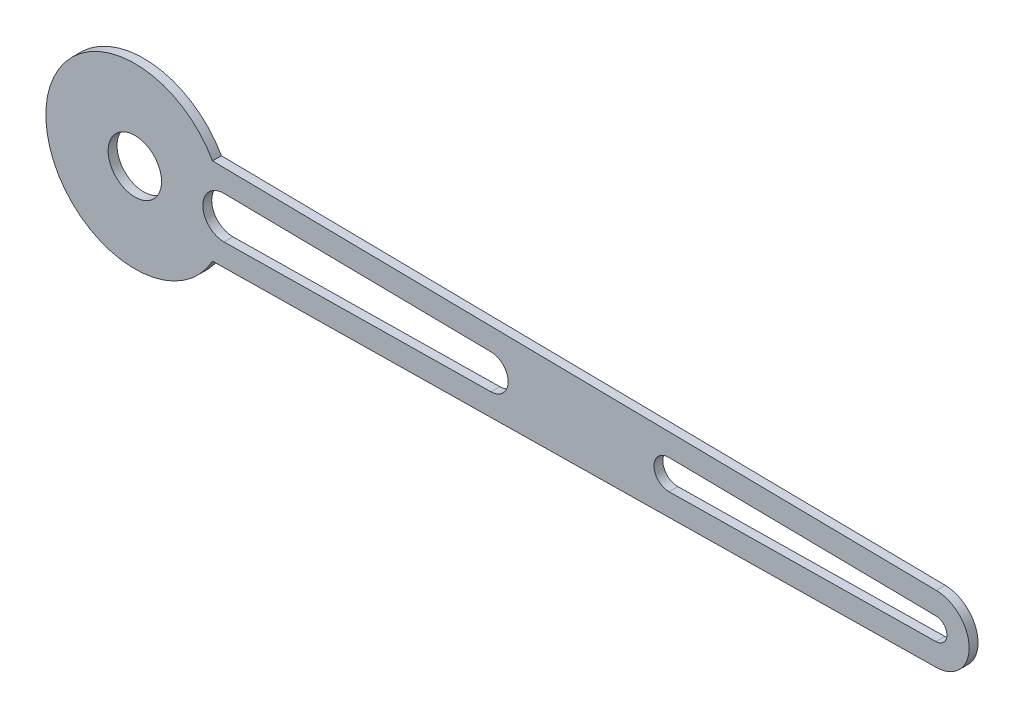
ISO-10303-21;
HEADER;
FILE_DESCRIPTION(('STEP AP214'),'2;1');
FILE_NAME('part.step','',(''),(''),'','','');
FILE_SCHEMA(('AUTOMOTIVE_DESIGN { 1 0 10303 214 1 1 1 1 }'));
ENDSEC;
DATA;
#1=APPLICATION_CONTEXT('core data for automotive mechanical design processes');
#2=APPLICATION_PROTOCOL_DEFINITION('international standard','automotive_design',2000,#1);
#3=PRODUCT_CONTEXT('',#1,'mechanical');
#4=PRODUCT('Part','Part','',(#3));
#5=PRODUCT_RELATED_PRODUCT_CATEGORY('part','',(#4));
#6=PRODUCT_DEFINITION_FORMATION('','',#4);
#7=PRODUCT_DEFINITION_CONTEXT('part definition',#1,'design');
#8=PRODUCT_DEFINITION('design','',#6,#7);
#9=PRODUCT_DEFINITION_SHAPE('','',#8);
#10=(LENGTH_UNIT() NAMED_UNIT(*) SI_UNIT(.MILLI.,.METRE.));
#11=(NAMED_UNIT(*) PLANE_ANGLE_UNIT() SI_UNIT($,.RADIAN.));
#12=(NAMED_UNIT(*) SI_UNIT($,.STERADIAN.) SOLID_ANGLE_UNIT());
#13=UNCERTAINTY_MEASURE_WITH_UNIT(LENGTH_MEASURE(1.E-05),#10,'distance_accuracy_value','');
#14=(GEOMETRIC_REPRESENTATION_CONTEXT(3) GLOBAL_UNCERTAINTY_ASSIGNED_CONTEXT((#13)) GLOBAL_UNIT_ASSIGNED_CONTEXT((#10,
#11,#12)) REPRESENTATION_CONTEXT('',''));
#15=CARTESIAN_POINT('',(0.,0.,0.));
#16=DIRECTION('',(0.,0.,1.));
#17=DIRECTION('',(1.,0.,0.));
#18=AXIS2_PLACEMENT_3D('',#15,#16,#17);
#19=CARTESIAN_POINT('',(9.,0.,0.1));
#20=DIRECTION('',(0.,0.,1.));
#21=DIRECTION('',(1.,0.,0.));
#22=AXIS2_PLACEMENT_3D('',#19,#20,#21);
#23=PLANE('',#22);
#24=DIRECTION('',(-0.999903544730907,0.0138888888888889,0.));
#25=VECTOR('',#24,1.);
#26=CARTESIAN_POINT('',(6.00231481481481,0.166650590788484,0.1));
#27=LINE('',#26,#25);
#28=CARTESIAN_POINT('',(9.00173611111111,0.124987943091363,0.1));
#29=VERTEX_POINT('',#28);
#30=CARTESIAN_POINT('',(6.00231481481481,0.166650590788484,0.1));
#31=VERTEX_POINT('',#30);
#32=EDGE_CURVE('E138',#29,#31,#27,.T.);
#33=ORIENTED_EDGE('',*,*,#32,.F.);
#34=CARTESIAN_POINT('',(9.,0.,0.1));
#35=DIRECTION('',(0.,0.,1.));
#36=DIRECTION('',(1.,0.,0.));
#37=AXIS2_PLACEMENT_3D('',#34,#35,#36);
#38=CIRCLE('',#37,0.125);
#39=CARTESIAN_POINT('',(9.00173611111111,-0.124987943091363,0.1));
#40=VERTEX_POINT('',#39);
#41=EDGE_CURVE('E130',#40,#29,#38,.T.);
#42=ORIENTED_EDGE('',*,*,#41,.F.);
#43=DIRECTION('',(0.999903544730907,0.0138888888888889,0.));
#44=VECTOR('',#43,1.);
#45=CARTESIAN_POINT('',(6.00231481481481,-0.166650590788484,0.1));
#46=LINE('',#45,#44);
#47=CARTESIAN_POINT('',(6.00231481481481,-0.166650590788484,0.1));
#48=VERTEX_POINT('',#47);
#49=EDGE_CURVE('E153',#48,#40,#46,.T.);
#50=ORIENTED_EDGE('',*,*,#49,.F.);
#51=CARTESIAN_POINT('',(6.,0.,0.1));
#52=DIRECTION('',(0.,0.,1.));
#53=DIRECTION('',(1.,0.,0.));
#54=AXIS2_PLACEMENT_3D('',#51,#52,#53);
#55=CIRCLE('',#54,0.166666666666667);
#56=EDGE_CURVE('E151',#31,#48,#55,.T.);
#57=ORIENTED_EDGE('',*,*,#56,.F.);
#58=EDGE_LOOP('',(#33,#42,#50,#57));
#59=FACE_BOUND('',#58,.T.);
#60=CARTESIAN_POINT('',(9.,0.,0.1));
#61=DIRECTION('',(0.,0.,1.));
#62=DIRECTION('',(1.,0.,0.));
#63=AXIS2_PLACEMENT_3D('',#60,#61,#62);
#64=CIRCLE('',#63,0.375);
#65=CARTESIAN_POINT('',(9.00520833333333,-0.37496382927409,0.1));
#66=VERTEX_POINT('',#65);
#67=CARTESIAN_POINT('',(9.00520833333333,0.37496382927409,0.1));
#68=VERTEX_POINT('',#67);
#69=EDGE_CURVE('E200',#66,#68,#64,.T.);
#70=ORIENTED_EDGE('',*,*,#69,.T.);
#71=DIRECTION('',(-0.999903544730907,0.0138888888888889,0.));
#72=VECTOR('',#71,1.);
#73=CARTESIAN_POINT('',(0.872886315515519,0.487923641757336,0.1));
#74=LINE('',#73,#72);
#75=CARTESIAN_POINT('',(0.872886315515519,0.487923641757336,0.1));
#76=VERTEX_POINT('',#75);
#77=EDGE_CURVE('E203',#68,#76,#74,.T.);
#78=ORIENTED_EDGE('',*,*,#77,.T.);
#79=CARTESIAN_POINT('',(0.,0.,0.1));
#80=DIRECTION('',(0.,0.,1.));
#81=DIRECTION('',(1.,0.,0.));
#82=AXIS2_PLACEMENT_3D('',#79,#80,#81);
#83=CIRCLE('',#82,1.);
#84=CARTESIAN_POINT('',(0.872886315515519,-0.487923641757336,0.1));
#85=VERTEX_POINT('',#84);
#86=EDGE_CURVE('E206',#76,#85,#83,.T.);
#87=ORIENTED_EDGE('',*,*,#86,.T.);
#88=DIRECTION('',(0.999903544730907,0.0138888888888889,0.));
#89=VECTOR('',#88,1.);
#90=CARTESIAN_POINT('',(0.872886315515519,-0.487923641757336,0.1));
#91=LINE('',#90,#89);
#92=EDGE_CURVE('E208',#85,#66,#91,.T.);
#93=ORIENTED_EDGE('',*,*,#92,.T.);
#94=EDGE_LOOP('',(#70,#78,#87,#93));
#95=FACE_BOUND('',#94,.T.);
#96=DIRECTION('',(0.999903544730907,0.0138888888888889,0.));
#97=VECTOR('',#96,1.);
#98=CARTESIAN_POINT('',(1.00327932098765,-0.236088336950353,0.1));
#99=LINE('',#98,#97);
#100=CARTESIAN_POINT('',(1.00327932098765,-0.236088336950353,0.1));
#101=VERTEX_POINT('',#100);
#102=CARTESIAN_POINT('',(4.00270061728395,-0.194425689253232,0.1));
#103=VERTEX_POINT('',#102);
#104=EDGE_CURVE('E171',#101,#103,#99,.T.);
#105=ORIENTED_EDGE('',*,*,#104,.F.);
#106=CARTESIAN_POINT('',(1.,0.,0.1));
#107=DIRECTION('',(0.,0.,1.));
#108=DIRECTION('',(1.,0.,0.));
#109=AXIS2_PLACEMENT_3D('',#106,#107,#108);
#110=CIRCLE('',#109,0.236111111111111);
#111=CARTESIAN_POINT('',(1.00327932098765,0.236088336950353,0.1));
#112=VERTEX_POINT('',#111);
#113=EDGE_CURVE('E169',#112,#101,#110,.T.);
#114=ORIENTED_EDGE('',*,*,#113,.F.);
#115=DIRECTION('',(-0.999903544730907,0.0138888888888889,0.));
#116=VECTOR('',#115,1.);
#117=CARTESIAN_POINT('',(1.00327932098765,0.236088336950353,0.1));
#118=LINE('',#117,#116);
#119=CARTESIAN_POINT('',(4.00270061728395,0.194425689253232,0.1));
#120=VERTEX_POINT('',#119);
#121=EDGE_CURVE('E177',#120,#112,#118,.T.);
#122=ORIENTED_EDGE('',*,*,#121,.F.);
#123=CARTESIAN_POINT('',(4.,0.,0.1));
#124=DIRECTION('',(0.,0.,1.));
#125=DIRECTION('',(1.,0.,0.));
#126=AXIS2_PLACEMENT_3D('',#123,#124,#125);
#127=CIRCLE('',#126,0.194444444444444);
#128=EDGE_CURVE('E174',#103,#120,#127,.T.);
#129=ORIENTED_EDGE('',*,*,#128,.F.);
#130=EDGE_LOOP('',(#105,#114,#122,#129));
#131=FACE_BOUND('',#130,.T.);
#132=CARTESIAN_POINT('',(0.,0.,0.1));
#133=DIRECTION('',(0.,0.,1.));
#134=DIRECTION('',(1.,0.,0.));
#135=AXIS2_PLACEMENT_3D('',#132,#133,#134);
#136=CIRCLE('',#135,0.3);
#137=CARTESIAN_POINT('',(0.3,0.,0.1));
#138=VERTEX_POINT('',#137);
#139=EDGE_CURVE('E159',#138,#138,#136,.T.);
#140=ORIENTED_EDGE('',*,*,#139,.F.);
#141=EDGE_LOOP('',(#140));
#142=FACE_BOUND('',#141,.T.);
#143=ADVANCED_FACE('F41',(#59,#95,#131,#142),#23,.T.);
#144=CARTESIAN_POINT('',(9.,0.,0.));
#145=DIRECTION('',(0.,0.,1.));
#146=DIRECTION('',(1.,0.,0.));
#147=AXIS2_PLACEMENT_3D('',#144,#145,#146);
#148=PLANE('',#147);
#149=CARTESIAN_POINT('',(9.,0.,0.));
#150=DIRECTION('',(0.,0.,1.));
#151=DIRECTION('',(1.,0.,0.));
#152=AXIS2_PLACEMENT_3D('',#149,#150,#151);
#153=CIRCLE('',#152,0.125);
#154=CARTESIAN_POINT('',(9.00173611111111,-0.124987943091363,0.));
#155=VERTEX_POINT('',#154);
#156=CARTESIAN_POINT('',(9.00173611111111,0.124987943091363,0.));
#157=VERTEX_POINT('',#156);
#158=EDGE_CURVE('E64',#155,#157,#153,.T.);
#159=ORIENTED_EDGE('',*,*,#158,.T.);
#160=DIRECTION('',(-0.999903544730907,0.0138888888888889,0.));
#161=VECTOR('',#160,1.);
#162=CARTESIAN_POINT('',(6.00231481481481,0.166650590788484,0.));
#163=LINE('',#162,#161);
#164=CARTESIAN_POINT('',(6.00231481481481,0.166650590788484,0.));
#165=VERTEX_POINT('',#164);
#166=EDGE_CURVE('E145',#157,#165,#163,.T.);
#167=ORIENTED_EDGE('',*,*,#166,.T.);
#168=CARTESIAN_POINT('',(6.,0.,0.));
#169=DIRECTION('',(0.,0.,1.));
#170=DIRECTION('',(1.,0.,0.));
#171=AXIS2_PLACEMENT_3D('',#168,#169,#170);
#172=CIRCLE('',#171,0.166666666666667);
#173=CARTESIAN_POINT('',(6.00231481481481,-0.166650590788484,0.));
#174=VERTEX_POINT('',#173);
#175=EDGE_CURVE('E161',#165,#174,#172,.T.);
#176=ORIENTED_EDGE('',*,*,#175,.T.);
#177=DIRECTION('',(0.999903544730907,0.0138888888888889,0.));
#178=VECTOR('',#177,1.);
#179=CARTESIAN_POINT('',(6.00231481481481,-0.166650590788484,0.));
#180=LINE('',#179,#178);
#181=EDGE_CURVE('E139',#174,#155,#180,.T.);
#182=ORIENTED_EDGE('',*,*,#181,.T.);
#183=EDGE_LOOP('',(#159,#167,#176,#182));
#184=FACE_BOUND('',#183,.T.);
#185=CARTESIAN_POINT('',(9.,0.,0.));
#186=DIRECTION('',(0.,0.,1.));
#187=DIRECTION('',(1.,0.,0.));
#188=AXIS2_PLACEMENT_3D('',#185,#186,#187);
#189=CIRCLE('',#188,0.375);
#190=CARTESIAN_POINT('',(9.00520833333333,-0.37496382927409,0.));
#191=VERTEX_POINT('',#190);
#192=CARTESIAN_POINT('',(9.00520833333333,0.37496382927409,0.));
#193=VERTEX_POINT('',#192);
#194=EDGE_CURVE('E199',#191,#193,#189,.T.);
#195=ORIENTED_EDGE('',*,*,#194,.F.);
#196=DIRECTION('',(0.999903544730907,0.0138888888888889,0.));
#197=VECTOR('',#196,1.);
#198=CARTESIAN_POINT('',(0.872886315515519,-0.487923641757336,0.));
#199=LINE('',#198,#197);
#200=CARTESIAN_POINT('',(0.872886315515519,-0.487923641757336,0.));
#201=VERTEX_POINT('',#200);
#202=EDGE_CURVE('E204',#201,#191,#199,.T.);
#203=ORIENTED_EDGE('',*,*,#202,.F.);
#204=CARTESIAN_POINT('',(0.,0.,0.));
#205=DIRECTION('',(0.,0.,1.));
#206=DIRECTION('',(1.,0.,0.));
#207=AXIS2_PLACEMENT_3D('',#204,#205,#206);
#208=CIRCLE('',#207,1.);
#209=CARTESIAN_POINT('',(0.872886315515519,0.487923641757336,0.));
#210=VERTEX_POINT('',#209);
#211=EDGE_CURVE('E215',#210,#201,#208,.T.);
#212=ORIENTED_EDGE('',*,*,#211,.F.);
#213=DIRECTION('',(-0.999903544730907,0.0138888888888889,0.));
#214=VECTOR('',#213,1.);
#215=CARTESIAN_POINT('',(0.872886315515519,0.487923641757336,0.));
#216=LINE('',#215,#214);
#217=EDGE_CURVE('E213',#193,#210,#216,.T.);
#218=ORIENTED_EDGE('',*,*,#217,.F.);
#219=EDGE_LOOP('',(#195,#203,#212,#218));
#220=FACE_BOUND('',#219,.T.);
#221=CARTESIAN_POINT('',(1.,0.,0.));
#222=DIRECTION('',(0.,0.,1.));
#223=DIRECTION('',(1.,0.,0.));
#224=AXIS2_PLACEMENT_3D('',#221,#222,#223);
#225=CIRCLE('',#224,0.236111111111111);
#226=CARTESIAN_POINT('',(1.00327932098765,0.236088336950353,0.));
#227=VERTEX_POINT('',#226);
#228=CARTESIAN_POINT('',(1.00327932098765,-0.236088336950353,0.));
#229=VERTEX_POINT('',#228);
#230=EDGE_CURVE('E146',#227,#229,#225,.T.);
#231=ORIENTED_EDGE('',*,*,#230,.T.);
#232=DIRECTION('',(0.999903544730907,0.0138888888888889,0.));
#233=VECTOR('',#232,1.);
#234=CARTESIAN_POINT('',(1.00327932098765,-0.236088336950353,0.));
#235=LINE('',#234,#233);
#236=CARTESIAN_POINT('',(4.00270061728395,-0.194425689253232,0.));
#237=VERTEX_POINT('',#236);
#238=EDGE_CURVE('E182',#229,#237,#235,.T.);
#239=ORIENTED_EDGE('',*,*,#238,.T.);
#240=CARTESIAN_POINT('',(4.,0.,0.));
#241=DIRECTION('',(0.,0.,1.));
#242=DIRECTION('',(1.,0.,0.));
#243=AXIS2_PLACEMENT_3D('',#240,#241,#242);
#244=CIRCLE('',#243,0.194444444444444);
#245=CARTESIAN_POINT('',(4.00270061728395,0.194425689253232,0.));
#246=VERTEX_POINT('',#245);
#247=EDGE_CURVE('E185',#237,#246,#244,.T.);
#248=ORIENTED_EDGE('',*,*,#247,.T.);
#249=DIRECTION('',(-0.999903544730907,0.0138888888888889,0.));
#250=VECTOR('',#249,1.);
#251=CARTESIAN_POINT('',(1.00327932098765,0.236088336950353,0.));
#252=LINE('',#251,#250);
#253=EDGE_CURVE('E172',#246,#227,#252,.T.);
#254=ORIENTED_EDGE('',*,*,#253,.T.);
#255=EDGE_LOOP('',(#231,#239,#248,#254));
#256=FACE_BOUND('',#255,.T.);
#257=CARTESIAN_POINT('',(0.,0.,0.));
#258=DIRECTION('',(0.,0.,1.));
#259=DIRECTION('',(1.,0.,0.));
#260=AXIS2_PLACEMENT_3D('',#257,#258,#259);
#261=CIRCLE('',#260,0.3);
#262=CARTESIAN_POINT('',(0.3,0.,0.));
#263=VERTEX_POINT('',#262);
#264=EDGE_CURVE('E289',#263,#263,#261,.T.);
#265=ORIENTED_EDGE('',*,*,#264,.T.);
#266=EDGE_LOOP('',(#265));
#267=FACE_BOUND('',#266,.T.);
#268=ADVANCED_FACE('F233',(#184,#220,#256,#267),#148,.F.);
#269=CARTESIAN_POINT('',(9.,0.,0.1));
#270=DIRECTION('',(0.,0.,-1.));
#271=DIRECTION('',(-1.,0.,0.));
#272=AXIS2_PLACEMENT_3D('',#269,#270,#271);
#273=CYLINDRICAL_SURFACE('',#272,0.375);
#274=ORIENTED_EDGE('',*,*,#194,.T.);
#275=DIRECTION('',(0.,0.,-1.));
#276=VECTOR('',#275,1.);
#277=CARTESIAN_POINT('',(9.00520833333333,0.37496382927409,0.1));
#278=LINE('',#277,#276);
#279=EDGE_CURVE('E11',#68,#193,#278,.T.);
#280=ORIENTED_EDGE('',*,*,#279,.F.);
#281=ORIENTED_EDGE('',*,*,#69,.F.);
#282=DIRECTION('',(0.,0.,-1.));
#283=VECTOR('',#282,1.);
#284=CARTESIAN_POINT('',(9.00520833333333,-0.37496382927409,0.1));
#285=LINE('',#284,#283);
#286=EDGE_CURVE('E210',#66,#191,#285,.T.);
#287=ORIENTED_EDGE('',*,*,#286,.T.);
#288=EDGE_LOOP('',(#274,#280,#281,#287));
#289=FACE_BOUND('',#288,.T.);
#290=ADVANCED_FACE('F43',(#289),#273,.T.);
#291=CARTESIAN_POINT('',(0.872886315515519,0.487923641757336,0.1));
#292=DIRECTION('',(-0.0138888888888889,-0.999903544730907,0.));
#293=DIRECTION('',(0.999903544730907,-0.0138888888888889,0.));
#294=AXIS2_PLACEMENT_3D('',#291,#292,#293);
#295=PLANE('',#294);
#296=ORIENTED_EDGE('',*,*,#217,.T.);
#297=DIRECTION('',(0.,0.,-1.));
#298=VECTOR('',#297,1.);
#299=CARTESIAN_POINT('',(0.872886315515519,0.487923641757336,0.1));
#300=LINE('',#299,#298);
#301=EDGE_CURVE('E49',#76,#210,#300,.T.);
#302=ORIENTED_EDGE('',*,*,#301,.F.);
#303=ORIENTED_EDGE('',*,*,#77,.F.);
#304=ORIENTED_EDGE('',*,*,#279,.T.);
#305=EDGE_LOOP('',(#296,#302,#303,#304));
#306=FACE_BOUND('',#305,.T.);
#307=ADVANCED_FACE('F243',(#306),#295,.F.);
#308=CARTESIAN_POINT('',(0.,0.,0.1));
#309=DIRECTION('',(0.,0.,-1.));
#310=DIRECTION('',(-1.,0.,0.));
#311=AXIS2_PLACEMENT_3D('',#308,#309,#310);
#312=CYLINDRICAL_SURFACE('',#311,1.);
#313=ORIENTED_EDGE('',*,*,#211,.T.);
#314=DIRECTION('',(0.,0.,-1.));
#315=VECTOR('',#314,1.);
#316=CARTESIAN_POINT('',(0.872886315515519,-0.487923641757336,0.1));
#317=LINE('',#316,#315);
#318=EDGE_CURVE('E220',#85,#201,#317,.T.);
#319=ORIENTED_EDGE('',*,*,#318,.F.);
#320=ORIENTED_EDGE('',*,*,#86,.F.);
#321=ORIENTED_EDGE('',*,*,#301,.T.);
#322=EDGE_LOOP('',(#313,#319,#320,#321));
#323=FACE_BOUND('',#322,.T.);
#324=ADVANCED_FACE('F227',(#323),#312,.T.);
#325=CARTESIAN_POINT('',(0.872886315515519,-0.487923641757336,0.1));
#326=DIRECTION('',(-0.0138888888888889,0.999903544730907,0.));
#327=DIRECTION('',(-0.999903544730907,-0.0138888888888889,0.));
#328=AXIS2_PLACEMENT_3D('',#325,#326,#327);
#329=PLANE('',#328);
#330=ORIENTED_EDGE('',*,*,#202,.T.);
#331=ORIENTED_EDGE('',*,*,#286,.F.);
#332=ORIENTED_EDGE('',*,*,#92,.F.);
#333=ORIENTED_EDGE('',*,*,#318,.T.);
#334=EDGE_LOOP('',(#330,#331,#332,#333));
#335=FACE_BOUND('',#334,.T.);
#336=ADVANCED_FACE('F237',(#335),#329,.F.);
#337=CARTESIAN_POINT('',(1.,0.,0.1));
#338=DIRECTION('',(0.,0.,-1.));
#339=DIRECTION('',(-1.,0.,0.));
#340=AXIS2_PLACEMENT_3D('',#337,#338,#339);
#341=CYLINDRICAL_SURFACE('',#340,0.236111111111111);
#342=ORIENTED_EDGE('',*,*,#230,.F.);
#343=DIRECTION('',(0.,0.,-1.));
#344=VECTOR('',#343,1.);
#345=CARTESIAN_POINT('',(1.00327932098765,0.236088336950353,0.1));
#346=LINE('',#345,#344);
#347=EDGE_CURVE('E179',#112,#227,#346,.T.);
#348=ORIENTED_EDGE('',*,*,#347,.F.);
#349=ORIENTED_EDGE('',*,*,#113,.T.);
#350=DIRECTION('',(0.,0.,-1.));
#351=VECTOR('',#350,1.);
#352=CARTESIAN_POINT('',(1.00327932098765,-0.236088336950353,0.1));
#353=LINE('',#352,#351);
#354=EDGE_CURVE('E196',#101,#229,#353,.T.);
#355=ORIENTED_EDGE('',*,*,#354,.T.);
#356=EDGE_LOOP('',(#342,#348,#349,#355));
#357=FACE_BOUND('',#356,.T.);
#358=ADVANCED_FACE('F258',(#357),#341,.F.);
#359=CARTESIAN_POINT('',(1.00327932098765,-0.236088336950353,0.1));
#360=DIRECTION('',(-0.0138888888888889,0.999903544730907,0.));
#361=DIRECTION('',(-0.999903544730907,-0.0138888888888889,0.));
#362=AXIS2_PLACEMENT_3D('',#359,#360,#361);
#363=PLANE('',#362);
#364=ORIENTED_EDGE('',*,*,#238,.F.);
#365=ORIENTED_EDGE('',*,*,#354,.F.);
#366=ORIENTED_EDGE('',*,*,#104,.T.);
#367=DIRECTION('',(0.,0.,-1.));
#368=VECTOR('',#367,1.);
#369=CARTESIAN_POINT('',(4.00270061728395,-0.194425689253232,0.1));
#370=LINE('',#369,#368);
#371=EDGE_CURVE('E194',#103,#237,#370,.T.);
#372=ORIENTED_EDGE('',*,*,#371,.T.);
#373=EDGE_LOOP('',(#364,#365,#366,#372));
#374=FACE_BOUND('',#373,.T.);
#375=ADVANCED_FACE('F265',(#374),#363,.T.);
#376=CARTESIAN_POINT('',(4.,0.,0.1));
#377=DIRECTION('',(0.,0.,-1.));
#378=DIRECTION('',(-1.,0.,0.));
#379=AXIS2_PLACEMENT_3D('',#376,#377,#378);
#380=CYLINDRICAL_SURFACE('',#379,0.194444444444444);
#381=ORIENTED_EDGE('',*,*,#247,.F.);
#382=ORIENTED_EDGE('',*,*,#371,.F.);
#383=ORIENTED_EDGE('',*,*,#128,.T.);
#384=DIRECTION('',(0.,0.,-1.));
#385=VECTOR('',#384,1.);
#386=CARTESIAN_POINT('',(4.00270061728395,0.194425689253232,0.1));
#387=LINE('',#386,#385);
#388=EDGE_CURVE('E192',#120,#246,#387,.T.);
#389=ORIENTED_EDGE('',*,*,#388,.T.);
#390=EDGE_LOOP('',(#381,#382,#383,#389));
#391=FACE_BOUND('',#390,.T.);
#392=ADVANCED_FACE('F270',(#391),#380,.F.);
#393=CARTESIAN_POINT('',(1.00327932098765,0.236088336950353,0.1));
#394=DIRECTION('',(-0.0138888888888889,-0.999903544730907,0.));
#395=DIRECTION('',(0.999903544730907,-0.0138888888888889,0.));
#396=AXIS2_PLACEMENT_3D('',#393,#394,#395);
#397=PLANE('',#396);
#398=ORIENTED_EDGE('',*,*,#253,.F.);
#399=ORIENTED_EDGE('',*,*,#388,.F.);
#400=ORIENTED_EDGE('',*,*,#121,.T.);
#401=ORIENTED_EDGE('',*,*,#347,.T.);
#402=EDGE_LOOP('',(#398,#399,#400,#401));
#403=FACE_BOUND('',#402,.T.);
#404=ADVANCED_FACE('F277',(#403),#397,.T.);
#405=CARTESIAN_POINT('',(9.,0.,0.1));
#406=DIRECTION('',(0.,0.,-1.));
#407=DIRECTION('',(-1.,0.,0.));
#408=AXIS2_PLACEMENT_3D('',#405,#406,#407);
#409=CYLINDRICAL_SURFACE('',#408,0.125);
#410=ORIENTED_EDGE('',*,*,#158,.F.);
#411=DIRECTION('',(0.,0.,-1.));
#412=VECTOR('',#411,1.);
#413=CARTESIAN_POINT('',(9.00173611111111,-0.124987943091363,0.1));
#414=LINE('',#413,#412);
#415=EDGE_CURVE('E134',#40,#155,#414,.T.);
#416=ORIENTED_EDGE('',*,*,#415,.F.);
#417=ORIENTED_EDGE('',*,*,#41,.T.);
#418=DIRECTION('',(0.,0.,-1.));
#419=VECTOR('',#418,1.);
#420=CARTESIAN_POINT('',(9.00173611111111,0.124987943091363,0.1));
#421=LINE('',#420,#419);
#422=EDGE_CURVE('E133',#29,#157,#421,.T.);
#423=ORIENTED_EDGE('',*,*,#422,.T.);
#424=EDGE_LOOP('',(#410,#416,#417,#423));
#425=FACE_BOUND('',#424,.T.);
#426=ADVANCED_FACE('F132',(#425),#409,.F.);
#427=CARTESIAN_POINT('',(6.00231481481481,0.166650590788484,0.1));
#428=DIRECTION('',(-0.0138888888888889,-0.999903544730907,0.));
#429=DIRECTION('',(0.999903544730907,-0.0138888888888889,0.));
#430=AXIS2_PLACEMENT_3D('',#427,#428,#429);
#431=PLANE('',#430);
#432=ORIENTED_EDGE('',*,*,#166,.F.);
#433=ORIENTED_EDGE('',*,*,#422,.F.);
#434=ORIENTED_EDGE('',*,*,#32,.T.);
#435=DIRECTION('',(0.,0.,-1.));
#436=VECTOR('',#435,1.);
#437=CARTESIAN_POINT('',(6.00231481481481,0.166650590788484,0.1));
#438=LINE('',#437,#436);
#439=EDGE_CURVE('E147',#31,#165,#438,.T.);
#440=ORIENTED_EDGE('',*,*,#439,.T.);
#441=EDGE_LOOP('',(#432,#433,#434,#440));
#442=FACE_BOUND('',#441,.T.);
#443=ADVANCED_FACE('F142',(#442),#431,.T.);
#444=CARTESIAN_POINT('',(6.,0.,0.1));
#445=DIRECTION('',(0.,0.,-1.));
#446=DIRECTION('',(-1.,0.,0.));
#447=AXIS2_PLACEMENT_3D('',#444,#445,#446);
#448=CYLINDRICAL_SURFACE('',#447,0.166666666666667);
#449=ORIENTED_EDGE('',*,*,#175,.F.);
#450=ORIENTED_EDGE('',*,*,#439,.F.);
#451=ORIENTED_EDGE('',*,*,#56,.T.);
#452=DIRECTION('',(0.,0.,-1.));
#453=VECTOR('',#452,1.);
#454=CARTESIAN_POINT('',(6.00231481481481,-0.166650590788484,0.1));
#455=LINE('',#454,#453);
#456=EDGE_CURVE('E56',#48,#174,#455,.T.);
#457=ORIENTED_EDGE('',*,*,#456,.T.);
#458=EDGE_LOOP('',(#449,#450,#451,#457));
#459=FACE_BOUND('',#458,.T.);
#460=ADVANCED_FACE('F301',(#459),#448,.F.);
#461=CARTESIAN_POINT('',(6.00231481481481,-0.166650590788484,0.1));
#462=DIRECTION('',(-0.0138888888888889,0.999903544730907,0.));
#463=DIRECTION('',(-0.999903544730907,-0.0138888888888889,0.));
#464=AXIS2_PLACEMENT_3D('',#461,#462,#463);
#465=PLANE('',#464);
#466=ORIENTED_EDGE('',*,*,#181,.F.);
#467=ORIENTED_EDGE('',*,*,#456,.F.);
#468=ORIENTED_EDGE('',*,*,#49,.T.);
#469=ORIENTED_EDGE('',*,*,#415,.T.);
#470=EDGE_LOOP('',(#466,#467,#468,#469));
#471=FACE_BOUND('',#470,.T.);
#472=ADVANCED_FACE('F296',(#471),#465,.T.);
#473=CARTESIAN_POINT('',(0.,0.,0.1));
#474=DIRECTION('',(0.,0.,-1.));
#475=DIRECTION('',(-1.,0.,0.));
#476=AXIS2_PLACEMENT_3D('',#473,#474,#475);
#477=CYLINDRICAL_SURFACE('',#476,0.3);
#478=ORIENTED_EDGE('',*,*,#139,.T.);
#479=EDGE_LOOP('',(#478));
#480=FACE_BOUND('',#479,.T.);
#481=ORIENTED_EDGE('',*,*,#264,.F.);
#482=EDGE_LOOP('',(#481));
#483=FACE_BOUND('',#482,.T.);
#484=ADVANCED_FACE('F294',(#480,#483),#477,.F.);
#485=CLOSED_SHELL('',(#143,#268,#290,#307,#324,#336,#358,#375,#392,#404,#426,#443,#460,#472,#484));
#486=MANIFOLD_SOLID_BREP('B2',#485);
#487=ADVANCED_BREP_SHAPE_REPRESENTATION('',(#18,#486),#14);
#488=SHAPE_DEFINITION_REPRESENTATION(#9,#487);
ENDSEC;
END-ISO-10303-21;
